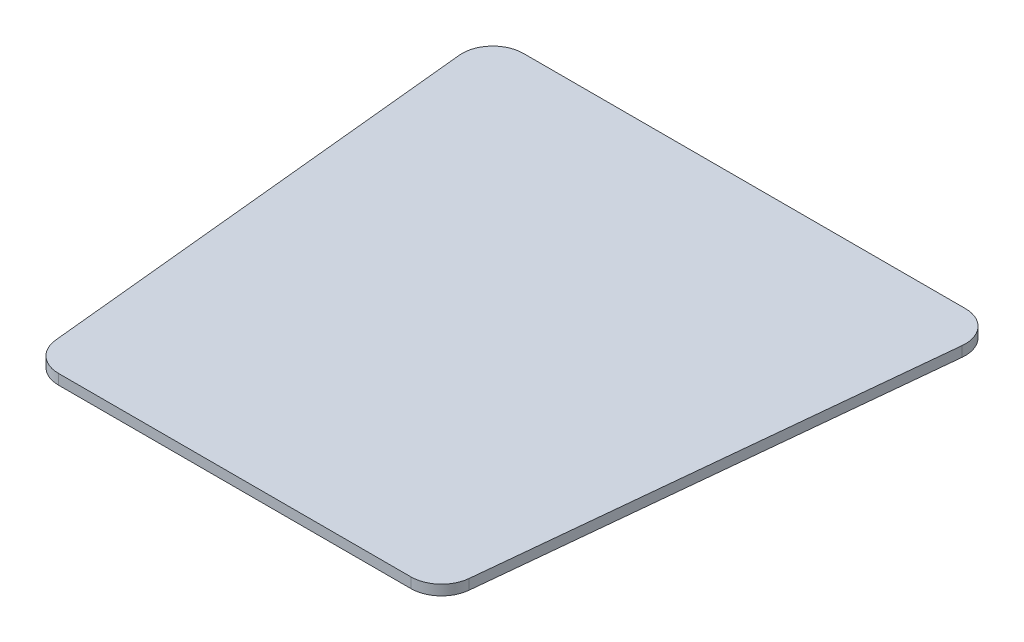
ISO-10303-21;
HEADER;
FILE_DESCRIPTION(('STEP AP214'),'2;1');
FILE_NAME('part.step','',(''),(''),'','','');
FILE_SCHEMA(('AUTOMOTIVE_DESIGN { 1 0 10303 214 1 1 1 1 }'));
ENDSEC;
DATA;
#1=APPLICATION_CONTEXT('core data for automotive mechanical design processes');
#2=APPLICATION_PROTOCOL_DEFINITION('international standard','automotive_design',2000,#1);
#3=PRODUCT_CONTEXT('',#1,'mechanical');
#4=PRODUCT('Part','Part','',(#3));
#5=PRODUCT_RELATED_PRODUCT_CATEGORY('part','',(#4));
#6=PRODUCT_DEFINITION_FORMATION('','',#4);
#7=PRODUCT_DEFINITION_CONTEXT('part definition',#1,'design');
#8=PRODUCT_DEFINITION('design','',#6,#7);
#9=PRODUCT_DEFINITION_SHAPE('','',#8);
#10=(LENGTH_UNIT() NAMED_UNIT(*) SI_UNIT(.MILLI.,.METRE.));
#11=(NAMED_UNIT(*) PLANE_ANGLE_UNIT() SI_UNIT($,.RADIAN.));
#12=(NAMED_UNIT(*) SI_UNIT($,.STERADIAN.) SOLID_ANGLE_UNIT());
#13=UNCERTAINTY_MEASURE_WITH_UNIT(LENGTH_MEASURE(1.E-05),#10,'distance_accuracy_value','');
#14=(GEOMETRIC_REPRESENTATION_CONTEXT(3) GLOBAL_UNCERTAINTY_ASSIGNED_CONTEXT((#13)) GLOBAL_UNIT_ASSIGNED_CONTEXT((#10,
#11,#12)) REPRESENTATION_CONTEXT('',''));
#15=CARTESIAN_POINT('',(0.,0.,0.));
#16=DIRECTION('',(0.,0.,1.));
#17=DIRECTION('',(1.,0.,0.));
#18=AXIS2_PLACEMENT_3D('',#15,#16,#17);
#19=CARTESIAN_POINT('',(-50.,2.,-50.));
#20=DIRECTION('',(0.995037190209989,0.,-0.099503719020999));
#21=DIRECTION('',(-0.099503719020999,0.,-0.995037190209989));
#22=AXIS2_PLACEMENT_3D('',#19,#20,#21);
#23=PLANE('',#22);
#24=DIRECTION('',(0.099503719020999,0.,0.995037190209989));
#25=VECTOR('',#24,1.);
#26=CARTESIAN_POINT('',(-50.,0.,-50.));
#27=LINE('',#26,#25);
#28=CARTESIAN_POINT('',(-49.3402977685874,0.,-43.402977685874));
#29=VERTEX_POINT('',#28);
#30=CARTESIAN_POINT('',(-40.5402977685874,0.,44.597022314126));
#31=VERTEX_POINT('',#30);
#32=EDGE_CURVE('E186',#29,#31,#27,.T.);
#33=ORIENTED_EDGE('',*,*,#32,.T.);
#34=DIRECTION('',(0.,-1.,0.));
#35=VECTOR('',#34,1.);
#36=CARTESIAN_POINT('',(-40.5402977685874,2.,44.597022314126));
#37=LINE('',#36,#35);
#38=CARTESIAN_POINT('',(-40.5402977685874,2.,44.597022314126));
#39=VERTEX_POINT('',#38);
#40=EDGE_CURVE('E11',#31,#39,#37,.F.);
#41=ORIENTED_EDGE('',*,*,#40,.T.);
#42=DIRECTION('',(0.099503719020999,0.,0.995037190209989));
#43=VECTOR('',#42,1.);
#44=CARTESIAN_POINT('',(-50.,2.,-50.));
#45=LINE('',#44,#43);
#46=CARTESIAN_POINT('',(-49.3402977685874,2.,-43.402977685874));
#47=VERTEX_POINT('',#46);
#48=EDGE_CURVE('E139',#47,#39,#45,.T.);
#49=ORIENTED_EDGE('',*,*,#48,.F.);
#50=DIRECTION('',(0.,-1.,0.));
#51=VECTOR('',#50,1.);
#52=CARTESIAN_POINT('',(-49.3402977685874,2.,-43.402977685874));
#53=LINE('',#52,#51);
#54=EDGE_CURVE('E52',#47,#29,#53,.T.);
#55=ORIENTED_EDGE('',*,*,#54,.T.);
#56=EDGE_LOOP('',(#33,#41,#49,#55));
#57=FACE_BOUND('',#56,.T.);
#58=ADVANCED_FACE('F43',(#57),#23,.F.);
#59=CARTESIAN_POINT('',(40.,2.,50.));
#60=DIRECTION('',(0.,0.,-1.));
#61=DIRECTION('',(-1.,0.,0.));
#62=AXIS2_PLACEMENT_3D('',#59,#60,#61);
#63=PLANE('',#62);
#64=DIRECTION('',(1.,0.,0.));
#65=VECTOR('',#64,1.);
#66=CARTESIAN_POINT('',(40.,0.,50.));
#67=LINE('',#66,#65);
#68=CARTESIAN_POINT('',(-34.5700746273275,0.,50.));
#69=VERTEX_POINT('',#68);
#70=CARTESIAN_POINT('',(34.5700746273275,0.,50.));
#71=VERTEX_POINT('',#70);
#72=EDGE_CURVE('E146',#69,#71,#67,.T.);
#73=ORIENTED_EDGE('',*,*,#72,.T.);
#74=DIRECTION('',(0.,-1.,0.));
#75=VECTOR('',#74,1.);
#76=CARTESIAN_POINT('',(34.5700746273275,2.,50.));
#77=LINE('',#76,#75);
#78=CARTESIAN_POINT('',(34.5700746273275,2.,50.));
#79=VERTEX_POINT('',#78);
#80=EDGE_CURVE('E59',#71,#79,#77,.F.);
#81=ORIENTED_EDGE('',*,*,#80,.T.);
#82=DIRECTION('',(1.,0.,0.));
#83=VECTOR('',#82,1.);
#84=CARTESIAN_POINT('',(40.,2.,50.));
#85=LINE('',#84,#83);
#86=CARTESIAN_POINT('',(-34.5700746273275,2.,50.));
#87=VERTEX_POINT('',#86);
#88=EDGE_CURVE('E144',#87,#79,#85,.T.);
#89=ORIENTED_EDGE('',*,*,#88,.F.);
#90=DIRECTION('',(0.,-1.,0.));
#91=VECTOR('',#90,1.);
#92=CARTESIAN_POINT('',(-34.5700746273275,2.,50.));
#93=LINE('',#92,#91);
#94=EDGE_CURVE('E175',#87,#69,#93,.T.);
#95=ORIENTED_EDGE('',*,*,#94,.T.);
#96=EDGE_LOOP('',(#73,#81,#89,#95));
#97=FACE_BOUND('',#96,.T.);
#98=ADVANCED_FACE('F211',(#97),#63,.F.);
#99=CARTESIAN_POINT('',(40.,2.,50.));
#100=DIRECTION('',(-0.995037190209989,0.,-0.0995037190209988));
#101=DIRECTION('',(-0.0995037190209989,0.,0.995037190209989));
#102=AXIS2_PLACEMENT_3D('',#99,#100,#101);
#103=PLANE('',#102);
#104=DIRECTION('',(0.0995037190209989,0.,-0.995037190209989));
#105=VECTOR('',#104,1.);
#106=CARTESIAN_POINT('',(40.,0.,50.));
#107=LINE('',#106,#105);
#108=CARTESIAN_POINT('',(40.5402977685874,0.,44.597022314126));
#109=VERTEX_POINT('',#108);
#110=CARTESIAN_POINT('',(49.3402977685874,0.,-43.4029776858739));
#111=VERTEX_POINT('',#110);
#112=EDGE_CURVE('E140',#109,#111,#107,.T.);
#113=ORIENTED_EDGE('',*,*,#112,.T.);
#114=DIRECTION('',(0.,-1.,0.));
#115=VECTOR('',#114,1.);
#116=CARTESIAN_POINT('',(49.3402977685874,2.,-43.4029776858739));
#117=LINE('',#116,#115);
#118=CARTESIAN_POINT('',(49.3402977685874,2.,-43.4029776858739));
#119=VERTEX_POINT('',#118);
#120=EDGE_CURVE('E115',#111,#119,#117,.F.);
#121=ORIENTED_EDGE('',*,*,#120,.T.);
#122=DIRECTION('',(0.0995037190209989,0.,-0.995037190209989));
#123=VECTOR('',#122,1.);
#124=CARTESIAN_POINT('',(40.,2.,50.));
#125=LINE('',#124,#123);
#126=CARTESIAN_POINT('',(40.5402977685874,2.,44.597022314126));
#127=VERTEX_POINT('',#126);
#128=EDGE_CURVE('E197',#127,#119,#125,.T.);
#129=ORIENTED_EDGE('',*,*,#128,.F.);
#130=DIRECTION('',(0.,-1.,0.));
#131=VECTOR('',#130,1.);
#132=CARTESIAN_POINT('',(40.5402977685874,2.,44.597022314126));
#133=LINE('',#132,#131);
#134=EDGE_CURVE('E121',#127,#109,#133,.T.);
#135=ORIENTED_EDGE('',*,*,#134,.T.);
#136=EDGE_LOOP('',(#113,#121,#129,#135));
#137=FACE_BOUND('',#136,.T.);
#138=ADVANCED_FACE('F210',(#137),#103,.F.);
#139=CARTESIAN_POINT('',(-40.,2.,-50.));
#140=DIRECTION('',(0.,0.,1.));
#141=DIRECTION('',(1.,0.,0.));
#142=AXIS2_PLACEMENT_3D('',#139,#140,#141);
#143=PLANE('',#142);
#144=DIRECTION('',(-1.,0.,0.));
#145=VECTOR('',#144,1.);
#146=CARTESIAN_POINT('',(50.,2.,-50.));
#147=LINE('',#146,#145);
#148=CARTESIAN_POINT('',(43.3700746273275,2.,-50.));
#149=VERTEX_POINT('',#148);
#150=CARTESIAN_POINT('',(-43.3700746273275,2.,-49.9999999999999));
#151=VERTEX_POINT('',#150);
#152=EDGE_CURVE('E131',#149,#151,#147,.T.);
#153=ORIENTED_EDGE('',*,*,#152,.F.);
#154=DIRECTION('',(0.,-1.,0.));
#155=VECTOR('',#154,1.);
#156=CARTESIAN_POINT('',(43.3700746273275,2.,-49.9999999999999));
#157=LINE('',#156,#155);
#158=CARTESIAN_POINT('',(43.3700746273275,0.,-49.9999999999999));
#159=VERTEX_POINT('',#158);
#160=EDGE_CURVE('E114',#149,#159,#157,.T.);
#161=ORIENTED_EDGE('',*,*,#160,.T.);
#162=DIRECTION('',(-1.,0.,0.));
#163=VECTOR('',#162,1.);
#164=CARTESIAN_POINT('',(-40.,0.,-50.));
#165=LINE('',#164,#163);
#166=CARTESIAN_POINT('',(-43.3700746273275,0.,-50.));
#167=VERTEX_POINT('',#166);
#168=EDGE_CURVE('E128',#159,#167,#165,.T.);
#169=ORIENTED_EDGE('',*,*,#168,.T.);
#170=DIRECTION('',(0.,-1.,0.));
#171=VECTOR('',#170,1.);
#172=CARTESIAN_POINT('',(-43.3700746273275,2.,-50.));
#173=LINE('',#172,#171);
#174=EDGE_CURVE('E134',#167,#151,#173,.F.);
#175=ORIENTED_EDGE('',*,*,#174,.T.);
#176=EDGE_LOOP('',(#153,#161,#169,#175));
#177=FACE_BOUND('',#176,.T.);
#178=ADVANCED_FACE('F127',(#177),#143,.F.);
#179=CARTESIAN_POINT('',(0.,2.,0.));
#180=DIRECTION('',(0.,-1.,0.));
#181=DIRECTION('',(0.,0.,-1.));
#182=AXIS2_PLACEMENT_3D('',#179,#180,#181);
#183=PLANE('',#182);
#184=ORIENTED_EDGE('',*,*,#128,.T.);
#185=CARTESIAN_POINT('',(43.3700746273274,2.,-43.9999999999999));
#186=DIRECTION('',(0.,-1.,0.));
#187=DIRECTION('',(0.,0.,-1.));
#188=AXIS2_PLACEMENT_3D('',#185,#186,#187);
#189=CIRCLE('',#188,6.);
#190=EDGE_CURVE('E172',#119,#149,#189,.F.);
#191=ORIENTED_EDGE('',*,*,#190,.T.);
#192=ORIENTED_EDGE('',*,*,#152,.T.);
#193=CARTESIAN_POINT('',(-43.3700746273275,2.,-44.));
#194=DIRECTION('',(0.,-1.,0.));
#195=DIRECTION('',(0.,0.,-1.));
#196=AXIS2_PLACEMENT_3D('',#193,#194,#195);
#197=CIRCLE('',#196,6.);
#198=EDGE_CURVE('E164',#151,#47,#197,.F.);
#199=ORIENTED_EDGE('',*,*,#198,.T.);
#200=ORIENTED_EDGE('',*,*,#48,.T.);
#201=CARTESIAN_POINT('',(-34.5700746273275,2.,44.));
#202=DIRECTION('',(0.,-1.,0.));
#203=DIRECTION('',(0.,0.,-1.));
#204=AXIS2_PLACEMENT_3D('',#201,#202,#203);
#205=CIRCLE('',#204,6.);
#206=EDGE_CURVE('E66',#39,#87,#205,.F.);
#207=ORIENTED_EDGE('',*,*,#206,.T.);
#208=ORIENTED_EDGE('',*,*,#88,.T.);
#209=CARTESIAN_POINT('',(34.5700746273275,2.,44.));
#210=DIRECTION('',(0.,-1.,0.));
#211=DIRECTION('',(0.,0.,-1.));
#212=AXIS2_PLACEMENT_3D('',#209,#210,#211);
#213=CIRCLE('',#212,6.);
#214=EDGE_CURVE('E169',#79,#127,#213,.F.);
#215=ORIENTED_EDGE('',*,*,#214,.T.);
#216=EDGE_LOOP('',(#184,#191,#192,#199,#200,#207,#208,#215));
#217=FACE_BOUND('',#216,.T.);
#218=ADVANCED_FACE('F203',(#217),#183,.F.);
#219=CARTESIAN_POINT('',(0.,0.,0.));
#220=DIRECTION('',(0.,-1.,0.));
#221=DIRECTION('',(0.,0.,-1.));
#222=AXIS2_PLACEMENT_3D('',#219,#220,#221);
#223=PLANE('',#222);
#224=ORIENTED_EDGE('',*,*,#168,.F.);
#225=CARTESIAN_POINT('',(43.3700746273274,0.,-43.9999999999999));
#226=DIRECTION('',(0.,-1.,0.));
#227=DIRECTION('',(0.,0.,-1.));
#228=AXIS2_PLACEMENT_3D('',#225,#226,#227);
#229=CIRCLE('',#228,6.);
#230=EDGE_CURVE('E110',#159,#111,#229,.T.);
#231=ORIENTED_EDGE('',*,*,#230,.T.);
#232=ORIENTED_EDGE('',*,*,#112,.F.);
#233=CARTESIAN_POINT('',(34.5700746273275,0.,44.));
#234=DIRECTION('',(0.,-1.,0.));
#235=DIRECTION('',(0.,0.,-1.));
#236=AXIS2_PLACEMENT_3D('',#233,#234,#235);
#237=CIRCLE('',#236,6.);
#238=EDGE_CURVE('E122',#109,#71,#237,.T.);
#239=ORIENTED_EDGE('',*,*,#238,.T.);
#240=ORIENTED_EDGE('',*,*,#72,.F.);
#241=CARTESIAN_POINT('',(-34.5700746273275,0.,44.));
#242=DIRECTION('',(0.,-1.,0.));
#243=DIRECTION('',(0.,0.,-1.));
#244=AXIS2_PLACEMENT_3D('',#241,#242,#243);
#245=CIRCLE('',#244,6.);
#246=EDGE_CURVE('E154',#69,#31,#245,.T.);
#247=ORIENTED_EDGE('',*,*,#246,.T.);
#248=ORIENTED_EDGE('',*,*,#32,.F.);
#249=CARTESIAN_POINT('',(-43.3700746273275,0.,-44.));
#250=DIRECTION('',(0.,-1.,0.));
#251=DIRECTION('',(0.,0.,-1.));
#252=AXIS2_PLACEMENT_3D('',#249,#250,#251);
#253=CIRCLE('',#252,6.);
#254=EDGE_CURVE('E133',#29,#167,#253,.T.);
#255=ORIENTED_EDGE('',*,*,#254,.T.);
#256=EDGE_LOOP('',(#224,#231,#232,#239,#240,#247,#248,#255));
#257=FACE_BOUND('',#256,.T.);
#258=ADVANCED_FACE('F136',(#257),#223,.T.);
#259=CARTESIAN_POINT('',(43.3700746273274,2.,-43.9999999999999));
#260=DIRECTION('',(0.,-1.,0.));
#261=DIRECTION('',(0.,0.,-1.));
#262=AXIS2_PLACEMENT_3D('',#259,#260,#261);
#263=CYLINDRICAL_SURFACE('',#262,6.);
#264=ORIENTED_EDGE('',*,*,#190,.F.);
#265=ORIENTED_EDGE('',*,*,#120,.F.);
#266=ORIENTED_EDGE('',*,*,#230,.F.);
#267=ORIENTED_EDGE('',*,*,#160,.F.);
#268=EDGE_LOOP('',(#264,#265,#266,#267));
#269=FACE_BOUND('',#268,.T.);
#270=ADVANCED_FACE('F113',(#269),#263,.T.);
#271=CARTESIAN_POINT('',(34.5700746273275,2.,44.));
#272=DIRECTION('',(0.,-1.,0.));
#273=DIRECTION('',(0.,0.,-1.));
#274=AXIS2_PLACEMENT_3D('',#271,#272,#273);
#275=CYLINDRICAL_SURFACE('',#274,6.);
#276=ORIENTED_EDGE('',*,*,#214,.F.);
#277=ORIENTED_EDGE('',*,*,#80,.F.);
#278=ORIENTED_EDGE('',*,*,#238,.F.);
#279=ORIENTED_EDGE('',*,*,#134,.F.);
#280=EDGE_LOOP('',(#276,#277,#278,#279));
#281=FACE_BOUND('',#280,.T.);
#282=ADVANCED_FACE('F208',(#281),#275,.T.);
#283=CARTESIAN_POINT('',(-34.5700746273275,2.,44.));
#284=DIRECTION('',(0.,-1.,0.));
#285=DIRECTION('',(0.,0.,-1.));
#286=AXIS2_PLACEMENT_3D('',#283,#284,#285);
#287=CYLINDRICAL_SURFACE('',#286,6.);
#288=ORIENTED_EDGE('',*,*,#206,.F.);
#289=ORIENTED_EDGE('',*,*,#40,.F.);
#290=ORIENTED_EDGE('',*,*,#246,.F.);
#291=ORIENTED_EDGE('',*,*,#94,.F.);
#292=EDGE_LOOP('',(#288,#289,#290,#291));
#293=FACE_BOUND('',#292,.T.);
#294=ADVANCED_FACE('F213',(#293),#287,.T.);
#295=CARTESIAN_POINT('',(-43.3700746273275,2.,-44.));
#296=DIRECTION('',(0.,-1.,0.));
#297=DIRECTION('',(0.,0.,-1.));
#298=AXIS2_PLACEMENT_3D('',#295,#296,#297);
#299=CYLINDRICAL_SURFACE('',#298,6.);
#300=ORIENTED_EDGE('',*,*,#198,.F.);
#301=ORIENTED_EDGE('',*,*,#174,.F.);
#302=ORIENTED_EDGE('',*,*,#254,.F.);
#303=ORIENTED_EDGE('',*,*,#54,.F.);
#304=EDGE_LOOP('',(#300,#301,#302,#303));
#305=FACE_BOUND('',#304,.T.);
#306=ADVANCED_FACE('F45',(#305),#299,.T.);
#307=CLOSED_SHELL('',(#58,#98,#138,#178,#218,#258,#270,#282,#294,#306));
#308=MANIFOLD_SOLID_BREP('B2',#307);
#309=ADVANCED_BREP_SHAPE_REPRESENTATION('',(#18,#308),#14);
#310=SHAPE_DEFINITION_REPRESENTATION(#9,#309);
ENDSEC;
END-ISO-10303-21;
